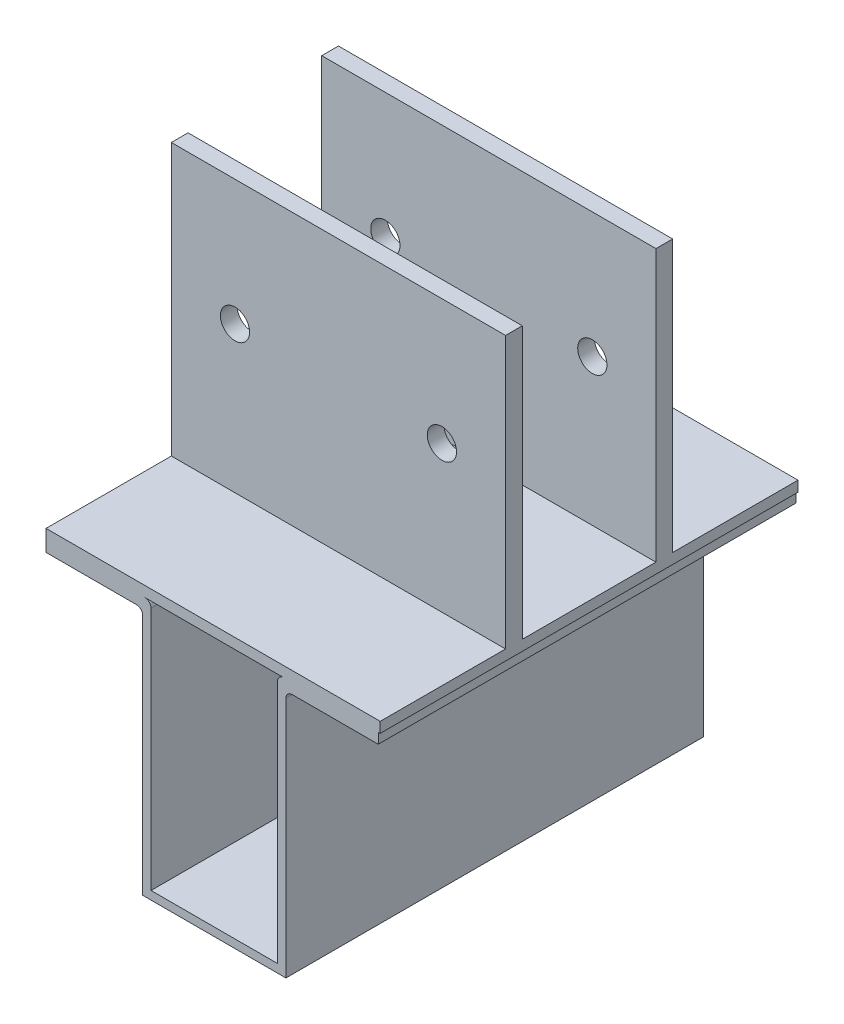
ISO-10303-21;
HEADER;
FILE_DESCRIPTION(('STEP AP214'),'2;1');
FILE_NAME('part.step','',(''),(''),'','','');
FILE_SCHEMA(('AUTOMOTIVE_DESIGN { 1 0 10303 214 1 1 1 1 }'));
ENDSEC;
DATA;
#1=APPLICATION_CONTEXT('core data for automotive mechanical design processes');
#2=APPLICATION_PROTOCOL_DEFINITION('international standard','automotive_design',2000,#1);
#3=PRODUCT_CONTEXT('',#1,'mechanical');
#4=PRODUCT('Part','Part','',(#3));
#5=PRODUCT_RELATED_PRODUCT_CATEGORY('part','',(#4));
#6=PRODUCT_DEFINITION_FORMATION('','',#4);
#7=PRODUCT_DEFINITION_CONTEXT('part definition',#1,'design');
#8=PRODUCT_DEFINITION('design','',#6,#7);
#9=PRODUCT_DEFINITION_SHAPE('','',#8);
#10=(LENGTH_UNIT() NAMED_UNIT(*) SI_UNIT(.MILLI.,.METRE.));
#11=(NAMED_UNIT(*) PLANE_ANGLE_UNIT() SI_UNIT($,.RADIAN.));
#12=(NAMED_UNIT(*) SI_UNIT($,.STERADIAN.) SOLID_ANGLE_UNIT());
#13=UNCERTAINTY_MEASURE_WITH_UNIT(LENGTH_MEASURE(1.E-05),#10,'distance_accuracy_value','');
#14=(GEOMETRIC_REPRESENTATION_CONTEXT(3) GLOBAL_UNCERTAINTY_ASSIGNED_CONTEXT((#13)) GLOBAL_UNIT_ASSIGNED_CONTEXT((#10,
#11,#12)) REPRESENTATION_CONTEXT('',''));
#15=CARTESIAN_POINT('',(0.,0.,0.));
#16=DIRECTION('',(0.,0.,1.));
#17=DIRECTION('',(1.,0.,0.));
#18=AXIS2_PLACEMENT_3D('',#15,#16,#17);
#19=CARTESIAN_POINT('',(0.,0.,0.));
#20=DIRECTION('',(0.,1.,0.));
#21=DIRECTION('',(0.,0.,1.));
#22=AXIS2_PLACEMENT_3D('',#19,#20,#21);
#23=PLANE('',#22);
#24=DIRECTION('',(1.,0.,0.));
#25=VECTOR('',#24,1.);
#26=CARTESIAN_POINT('',(40.,0.,100.));
#27=LINE('',#26,#25);
#28=CARTESIAN_POINT('',(119.056976735996,0.,100.));
#29=VERTEX_POINT('',#28);
#30=CARTESIAN_POINT('',(120.,0.,100.));
#31=VERTEX_POINT('',#30);
#32=EDGE_CURVE('E444',#29,#31,#27,.T.);
#33=ORIENTED_EDGE('',*,*,#32,.F.);
#34=DIRECTION('',(0.,0.,-1.));
#35=VECTOR('',#34,1.);
#36=CARTESIAN_POINT('',(119.056976735996,0.,100.));
#37=LINE('',#36,#35);
#38=CARTESIAN_POINT('',(119.056976735996,0.,-100.));
#39=VERTEX_POINT('',#38);
#40=EDGE_CURVE('E327',#29,#39,#37,.T.);
#41=ORIENTED_EDGE('',*,*,#40,.T.);
#42=DIRECTION('',(-1.,0.,0.));
#43=VECTOR('',#42,1.);
#44=CARTESIAN_POINT('',(40.,0.,-100.));
#45=LINE('',#44,#43);
#46=CARTESIAN_POINT('',(120.,0.,-100.));
#47=VERTEX_POINT('',#46);
#48=EDGE_CURVE('E447',#47,#39,#45,.T.);
#49=ORIENTED_EDGE('',*,*,#48,.F.);
#50=DIRECTION('',(0.,0.,1.));
#51=VECTOR('',#50,1.);
#52=CARTESIAN_POINT('',(120.,0.,100.));
#53=LINE('',#52,#51);
#54=EDGE_CURVE('E375',#47,#31,#53,.T.);
#55=ORIENTED_EDGE('',*,*,#54,.T.);
#56=EDGE_LOOP('',(#33,#41,#49,#55));
#57=FACE_BOUND('',#56,.T.);
#58=ADVANCED_FACE('F33',(#57),#23,.F.);
#59=CARTESIAN_POINT('',(0.,5.,0.));
#60=DIRECTION('',(0.,1.,0.));
#61=DIRECTION('',(0.,0.,1.));
#62=AXIS2_PLACEMENT_3D('',#59,#60,#61);
#63=PLANE('',#62);
#64=DIRECTION('',(-1.,0.,0.));
#65=VECTOR('',#64,1.);
#66=CARTESIAN_POINT('',(-40.,5.,32.));
#67=LINE('',#66,#65);
#68=CARTESIAN_POINT('',(120.,5.,32.));
#69=VERTEX_POINT('',#68);
#70=CARTESIAN_POINT('',(-40.,5.,32.));
#71=VERTEX_POINT('',#70);
#72=EDGE_CURVE('E403',#69,#71,#67,.T.);
#73=ORIENTED_EDGE('',*,*,#72,.F.);
#74=DIRECTION('',(0.,0.,1.));
#75=VECTOR('',#74,1.);
#76=CARTESIAN_POINT('',(120.,5.,100.));
#77=LINE('',#76,#75);
#78=CARTESIAN_POINT('',(120.,5.,-32.));
#79=VERTEX_POINT('',#78);
#80=EDGE_CURVE('E380',#79,#69,#77,.T.);
#81=ORIENTED_EDGE('',*,*,#80,.F.);
#82=DIRECTION('',(1.,0.,0.));
#83=VECTOR('',#82,1.);
#84=CARTESIAN_POINT('',(40.,5.,-32.));
#85=LINE('',#84,#83);
#86=CARTESIAN_POINT('',(-40.,5.,-32.));
#87=VERTEX_POINT('',#86);
#88=EDGE_CURVE('E419',#87,#79,#85,.T.);
#89=ORIENTED_EDGE('',*,*,#88,.F.);
#90=DIRECTION('',(0.,0.,1.));
#91=VECTOR('',#90,1.);
#92=CARTESIAN_POINT('',(-40.,5.,100.));
#93=LINE('',#92,#91);
#94=EDGE_CURVE('E436',#87,#71,#93,.T.);
#95=ORIENTED_EDGE('',*,*,#94,.T.);
#96=EDGE_LOOP('',(#73,#81,#89,#95));
#97=FACE_BOUND('',#96,.T.);
#98=ADVANCED_FACE('F474',(#97),#63,.T.);
#99=CARTESIAN_POINT('',(120.,5.,40.));
#100=VERTEX_POINT('',#99);
#101=CARTESIAN_POINT('',(120.,5.,100.));
#102=VERTEX_POINT('',#101);
#103=EDGE_CURVE('E381',#100,#102,#77,.T.);
#104=ORIENTED_EDGE('',*,*,#103,.F.);
#105=DIRECTION('',(1.,0.,0.));
#106=VECTOR('',#105,1.);
#107=CARTESIAN_POINT('',(-40.,5.,40.));
#108=LINE('',#107,#106);
#109=CARTESIAN_POINT('',(-40.,5.,40.));
#110=VERTEX_POINT('',#109);
#111=EDGE_CURVE('E58',#110,#100,#108,.T.);
#112=ORIENTED_EDGE('',*,*,#111,.F.);
#113=CARTESIAN_POINT('',(-40.,5.,100.));
#114=VERTEX_POINT('',#113);
#115=EDGE_CURVE('E437',#110,#114,#93,.T.);
#116=ORIENTED_EDGE('',*,*,#115,.T.);
#117=DIRECTION('',(1.,0.,0.));
#118=VECTOR('',#117,1.);
#119=CARTESIAN_POINT('',(40.,5.,100.));
#120=LINE('',#119,#118);
#121=EDGE_CURVE('E435',#114,#102,#120,.T.);
#122=ORIENTED_EDGE('',*,*,#121,.T.);
#123=EDGE_LOOP('',(#104,#112,#116,#122));
#124=FACE_BOUND('',#123,.T.);
#125=ADVANCED_FACE('F483',(#124),#63,.T.);
#126=CARTESIAN_POINT('',(-40.,5.,100.));
#127=DIRECTION('',(1.,0.,0.));
#128=DIRECTION('',(0.,0.,-1.));
#129=AXIS2_PLACEMENT_3D('',#126,#127,#128);
#130=PLANE('',#129);
#131=DIRECTION('',(0.,0.,1.));
#132=VECTOR('',#131,1.);
#133=CARTESIAN_POINT('',(-40.,0.,100.));
#134=LINE('',#133,#132);
#135=CARTESIAN_POINT('',(-40.,0.,-100.));
#136=VERTEX_POINT('',#135);
#137=CARTESIAN_POINT('',(-40.,0.,100.));
#138=VERTEX_POINT('',#137);
#139=EDGE_CURVE('E432',#136,#138,#134,.T.);
#140=ORIENTED_EDGE('',*,*,#139,.T.);
#141=DIRECTION('',(0.,-1.,0.));
#142=VECTOR('',#141,1.);
#143=CARTESIAN_POINT('',(-40.,5.,100.));
#144=LINE('',#143,#142);
#145=EDGE_CURVE('E11',#114,#138,#144,.T.);
#146=ORIENTED_EDGE('',*,*,#145,.F.);
#147=ORIENTED_EDGE('',*,*,#115,.F.);
#148=DIRECTION('',(0.,-1.,0.));
#149=VECTOR('',#148,1.);
#150=CARTESIAN_POINT('',(-40.,135.,40.));
#151=LINE('',#150,#149);
#152=CARTESIAN_POINT('',(-40.,135.,40.));
#153=VERTEX_POINT('',#152);
#154=EDGE_CURVE('E413',#153,#110,#151,.T.);
#155=ORIENTED_EDGE('',*,*,#154,.F.);
#156=DIRECTION('',(0.,0.,1.));
#157=VECTOR('',#156,1.);
#158=CARTESIAN_POINT('',(-40.,135.,32.));
#159=LINE('',#158,#157);
#160=CARTESIAN_POINT('',(-40.,135.,32.));
#161=VERTEX_POINT('',#160);
#162=EDGE_CURVE('E399',#161,#153,#159,.T.);
#163=ORIENTED_EDGE('',*,*,#162,.F.);
#164=DIRECTION('',(0.,-1.,0.));
#165=VECTOR('',#164,1.);
#166=CARTESIAN_POINT('',(-40.,135.,32.));
#167=LINE('',#166,#165);
#168=EDGE_CURVE('E407',#161,#71,#167,.T.);
#169=ORIENTED_EDGE('',*,*,#168,.T.);
#170=ORIENTED_EDGE('',*,*,#94,.F.);
#171=DIRECTION('',(0.,-1.,0.));
#172=VECTOR('',#171,1.);
#173=CARTESIAN_POINT('',(-40.,135.,-32.));
#174=LINE('',#173,#172);
#175=CARTESIAN_POINT('',(-40.,135.,-32.));
#176=VERTEX_POINT('',#175);
#177=EDGE_CURVE('E423',#176,#87,#174,.T.);
#178=ORIENTED_EDGE('',*,*,#177,.F.);
#179=DIRECTION('',(0.,0.,1.));
#180=VECTOR('',#179,1.);
#181=CARTESIAN_POINT('',(-40.,135.,-32.));
#182=LINE('',#181,#180);
#183=CARTESIAN_POINT('',(-40.,135.,-40.));
#184=VERTEX_POINT('',#183);
#185=EDGE_CURVE('E418',#184,#176,#182,.T.);
#186=ORIENTED_EDGE('',*,*,#185,.F.);
#187=DIRECTION('',(0.,-1.,0.));
#188=VECTOR('',#187,1.);
#189=CARTESIAN_POINT('',(-40.,135.,-40.));
#190=LINE('',#189,#188);
#191=CARTESIAN_POINT('',(-40.,5.,-40.));
#192=VERTEX_POINT('',#191);
#193=EDGE_CURVE('E429',#184,#192,#190,.T.);
#194=ORIENTED_EDGE('',*,*,#193,.T.);
#195=CARTESIAN_POINT('',(-40.,5.,-100.));
#196=VERTEX_POINT('',#195);
#197=EDGE_CURVE('E433',#196,#192,#93,.T.);
#198=ORIENTED_EDGE('',*,*,#197,.F.);
#199=DIRECTION('',(0.,-1.,0.));
#200=VECTOR('',#199,1.);
#201=CARTESIAN_POINT('',(-40.,5.,-100.));
#202=LINE('',#201,#200);
#203=EDGE_CURVE('E42',#196,#136,#202,.T.);
#204=ORIENTED_EDGE('',*,*,#203,.T.);
#205=EDGE_LOOP('',(#140,#146,#147,#155,#163,#169,#170,#178,#186,#194,#198,#204));
#206=FACE_BOUND('',#205,.T.);
#207=ADVANCED_FACE('F35',(#206),#130,.F.);
#208=CARTESIAN_POINT('',(40.,5.,100.));
#209=DIRECTION('',(0.,0.,-1.));
#210=DIRECTION('',(-1.,0.,0.));
#211=AXIS2_PLACEMENT_3D('',#208,#209,#210);
#212=PLANE('',#211);
#213=CARTESIAN_POINT('',(7.27123143464801,0.,100.));
#214=VERTEX_POINT('',#213);
#215=CARTESIAN_POINT('',(73.8451123410804,0.,100.));
#216=VERTEX_POINT('',#215);
#217=EDGE_CURVE('E446',#214,#216,#27,.T.);
#218=ORIENTED_EDGE('',*,*,#217,.T.);
#219=CARTESIAN_POINT('',(73.8451123410804,-3.,100.));
#220=DIRECTION('',(0.,0.,-1.));
#221=DIRECTION('',(-1.,0.,0.));
#222=AXIS2_PLACEMENT_3D('',#219,#220,#221);
#223=CIRCLE('',#222,3.);
#224=CARTESIAN_POINT('',(70.8451123410804,-3.00000000000002,100.));
#225=VERTEX_POINT('',#224);
#226=EDGE_CURVE('E266',#216,#225,#223,.F.);
#227=ORIENTED_EDGE('',*,*,#226,.T.);
#228=DIRECTION('',(0.,-1.,0.));
#229=VECTOR('',#228,1.);
#230=CARTESIAN_POINT('',(70.8451123410804,0.,100.));
#231=LINE('',#230,#229);
#232=CARTESIAN_POINT('',(70.8451123410803,-120.,100.));
#233=VERTEX_POINT('',#232);
#234=EDGE_CURVE('E264',#225,#233,#231,.T.);
#235=ORIENTED_EDGE('',*,*,#234,.T.);
#236=DIRECTION('',(1.,0.,0.));
#237=VECTOR('',#236,1.);
#238=CARTESIAN_POINT('',(0.,-120.,100.));
#239=LINE('',#238,#237);
#240=CARTESIAN_POINT('',(10.271231434648,-120.,100.));
#241=VERTEX_POINT('',#240);
#242=EDGE_CURVE('E261',#241,#233,#239,.T.);
#243=ORIENTED_EDGE('',*,*,#242,.F.);
#244=DIRECTION('',(0.,-1.,0.));
#245=VECTOR('',#244,1.);
#246=CARTESIAN_POINT('',(10.271231434648,0.,100.));
#247=LINE('',#246,#245);
#248=CARTESIAN_POINT('',(10.271231434648,-3.00000000000002,100.));
#249=VERTEX_POINT('',#248);
#250=EDGE_CURVE('E258',#249,#241,#247,.T.);
#251=ORIENTED_EDGE('',*,*,#250,.F.);
#252=CARTESIAN_POINT('',(7.27123143464803,-3.,100.));
#253=DIRECTION('',(0.,0.,-1.));
#254=DIRECTION('',(-1.,0.,0.));
#255=AXIS2_PLACEMENT_3D('',#252,#253,#254);
#256=CIRCLE('',#255,3.);
#257=EDGE_CURVE('E255',#214,#249,#256,.T.);
#258=ORIENTED_EDGE('',*,*,#257,.F.);
#259=EDGE_LOOP('',(#218,#227,#235,#243,#251,#258));
#260=FACE_BOUND('',#259,.T.);
#261=ORIENTED_EDGE('',*,*,#145,.T.);
#262=DIRECTION('',(-1.,0.,0.));
#263=VECTOR('',#262,1.);
#264=CARTESIAN_POINT('',(0.,0.,100.));
#265=LINE('',#264,#263);
#266=CARTESIAN_POINT('',(-40.0009690455203,0.,100.));
#267=VERTEX_POINT('',#266);
#268=EDGE_CURVE('E253',#138,#267,#265,.T.);
#269=ORIENTED_EDGE('',*,*,#268,.T.);
#270=DIRECTION('',(0.,-1.,0.));
#271=VECTOR('',#270,1.);
#272=CARTESIAN_POINT('',(-40.0009690455203,0.,100.));
#273=LINE('',#272,#271);
#274=CARTESIAN_POINT('',(-40.0009690455203,-4.97783194585386,100.));
#275=VERTEX_POINT('',#274);
#276=EDGE_CURVE('E249',#267,#275,#273,.T.);
#277=ORIENTED_EDGE('',*,*,#276,.T.);
#278=DIRECTION('',(-1.,0.,0.));
#279=VECTOR('',#278,1.);
#280=CARTESIAN_POINT('',(0.,-4.97783194585386,100.));
#281=LINE('',#280,#279);
#282=CARTESIAN_POINT('',(3.27123143464801,-4.97783194585386,100.));
#283=VERTEX_POINT('',#282);
#284=EDGE_CURVE('E247',#283,#275,#281,.T.);
#285=ORIENTED_EDGE('',*,*,#284,.F.);
#286=CARTESIAN_POINT('',(3.27123143464803,-7.97783194585385,100.));
#287=DIRECTION('',(0.,0.,-1.));
#288=DIRECTION('',(-1.,0.,0.));
#289=AXIS2_PLACEMENT_3D('',#286,#287,#288);
#290=CIRCLE('',#289,3.);
#291=CARTESIAN_POINT('',(6.27123143464803,-7.97783194585388,100.));
#292=VERTEX_POINT('',#291);
#293=EDGE_CURVE('E226',#292,#283,#290,.F.);
#294=ORIENTED_EDGE('',*,*,#293,.F.);
#295=DIRECTION('',(0.,-1.,0.));
#296=VECTOR('',#295,1.);
#297=CARTESIAN_POINT('',(6.27123143464803,0.,100.));
#298=LINE('',#297,#296);
#299=CARTESIAN_POINT('',(6.27123143464803,-124.,100.));
#300=VERTEX_POINT('',#299);
#301=EDGE_CURVE('E237',#292,#300,#298,.T.);
#302=ORIENTED_EDGE('',*,*,#301,.T.);
#303=DIRECTION('',(1.,0.,0.));
#304=VECTOR('',#303,1.);
#305=CARTESIAN_POINT('',(0.,-124.,100.));
#306=LINE('',#305,#304);
#307=CARTESIAN_POINT('',(74.8451123410804,-124.,100.));
#308=VERTEX_POINT('',#307);
#309=EDGE_CURVE('E233',#300,#308,#306,.T.);
#310=ORIENTED_EDGE('',*,*,#309,.T.);
#311=DIRECTION('',(0.,-1.,0.));
#312=VECTOR('',#311,1.);
#313=CARTESIAN_POINT('',(74.8451123410804,0.,100.));
#314=LINE('',#313,#312);
#315=CARTESIAN_POINT('',(74.8451123410804,-7.97783194585388,100.));
#316=VERTEX_POINT('',#315);
#317=EDGE_CURVE('E275',#316,#308,#314,.T.);
#318=ORIENTED_EDGE('',*,*,#317,.F.);
#319=CARTESIAN_POINT('',(77.8451123410804,-7.97783194585385,100.));
#320=DIRECTION('',(0.,0.,-1.));
#321=DIRECTION('',(-1.,0.,0.));
#322=AXIS2_PLACEMENT_3D('',#319,#320,#321);
#323=CIRCLE('',#322,3.);
#324=CARTESIAN_POINT('',(77.8451123410804,-4.97783194585386,100.));
#325=VERTEX_POINT('',#324);
#326=EDGE_CURVE('E273',#316,#325,#323,.T.);
#327=ORIENTED_EDGE('',*,*,#326,.T.);
#328=DIRECTION('',(1.,0.,0.));
#329=VECTOR('',#328,1.);
#330=CARTESIAN_POINT('',(0.,-4.97783194585386,100.));
#331=LINE('',#330,#329);
#332=CARTESIAN_POINT('',(119.056976735996,-4.97783194585386,100.));
#333=VERTEX_POINT('',#332);
#334=EDGE_CURVE('E271',#325,#333,#331,.T.);
#335=ORIENTED_EDGE('',*,*,#334,.T.);
#336=DIRECTION('',(0.,-1.,0.));
#337=VECTOR('',#336,1.);
#338=CARTESIAN_POINT('',(119.056976735996,0.,100.));
#339=LINE('',#338,#337);
#340=EDGE_CURVE('E268',#29,#333,#339,.T.);
#341=ORIENTED_EDGE('',*,*,#340,.F.);
#342=ORIENTED_EDGE('',*,*,#32,.T.);
#343=DIRECTION('',(0.,-1.,0.));
#344=VECTOR('',#343,1.);
#345=CARTESIAN_POINT('',(120.,5.,100.));
#346=LINE('',#345,#344);
#347=EDGE_CURVE('E379',#102,#31,#346,.T.);
#348=ORIENTED_EDGE('',*,*,#347,.F.);
#349=ORIENTED_EDGE('',*,*,#121,.F.);
#350=EDGE_LOOP('',(#261,#269,#277,#285,#294,#302,#310,#318,#327,#335,#341,#342,#348,#349));
#351=FACE_BOUND('',#350,.T.);
#352=ADVANCED_FACE('F245',(#260,#351),#212,.F.);
#353=CARTESIAN_POINT('',(40.,5.,-100.));
#354=DIRECTION('',(0.,0.,1.));
#355=DIRECTION('',(1.,0.,0.));
#356=AXIS2_PLACEMENT_3D('',#353,#354,#355);
#357=PLANE('',#356);
#358=CARTESIAN_POINT('',(73.8451123410804,-3.,-100.));
#359=DIRECTION('',(0.,0.,-1.));
#360=DIRECTION('',(-1.,0.,0.));
#361=AXIS2_PLACEMENT_3D('',#358,#359,#360);
#362=CIRCLE('',#361,3.);
#363=CARTESIAN_POINT('',(73.8451123410804,0.,-100.));
#364=VERTEX_POINT('',#363);
#365=CARTESIAN_POINT('',(70.8451123410804,-3.00000000000002,-100.));
#366=VERTEX_POINT('',#365);
#367=EDGE_CURVE('E50',#364,#366,#362,.F.);
#368=ORIENTED_EDGE('',*,*,#367,.F.);
#369=CARTESIAN_POINT('',(7.27123143464801,0.,-100.));
#370=VERTEX_POINT('',#369);
#371=EDGE_CURVE('E450',#364,#370,#45,.T.);
#372=ORIENTED_EDGE('',*,*,#371,.T.);
#373=CARTESIAN_POINT('',(7.27123143464803,-3.,-100.));
#374=DIRECTION('',(0.,0.,-1.));
#375=DIRECTION('',(-1.,0.,0.));
#376=AXIS2_PLACEMENT_3D('',#373,#374,#375);
#377=CIRCLE('',#376,3.);
#378=CARTESIAN_POINT('',(10.271231434648,-3.00000000000002,-100.));
#379=VERTEX_POINT('',#378);
#380=EDGE_CURVE('E290',#370,#379,#377,.T.);
#381=ORIENTED_EDGE('',*,*,#380,.T.);
#382=DIRECTION('',(0.,-1.,0.));
#383=VECTOR('',#382,1.);
#384=CARTESIAN_POINT('',(10.271231434648,0.,-100.));
#385=LINE('',#384,#383);
#386=CARTESIAN_POINT('',(10.271231434648,-120.,-100.));
#387=VERTEX_POINT('',#386);
#388=EDGE_CURVE('E293',#379,#387,#385,.T.);
#389=ORIENTED_EDGE('',*,*,#388,.T.);
#390=DIRECTION('',(1.,0.,0.));
#391=VECTOR('',#390,1.);
#392=CARTESIAN_POINT('',(0.,-120.,-100.));
#393=LINE('',#392,#391);
#394=CARTESIAN_POINT('',(70.8451123410803,-120.,-100.));
#395=VERTEX_POINT('',#394);
#396=EDGE_CURVE('E296',#387,#395,#393,.T.);
#397=ORIENTED_EDGE('',*,*,#396,.T.);
#398=DIRECTION('',(0.,-1.,0.));
#399=VECTOR('',#398,1.);
#400=CARTESIAN_POINT('',(70.8451123410804,0.,-100.));
#401=LINE('',#400,#399);
#402=EDGE_CURVE('E299',#366,#395,#401,.T.);
#403=ORIENTED_EDGE('',*,*,#402,.F.);
#404=EDGE_LOOP('',(#368,#372,#381,#389,#397,#403));
#405=FACE_BOUND('',#404,.T.);
#406=ORIENTED_EDGE('',*,*,#48,.T.);
#407=DIRECTION('',(0.,-1.,0.));
#408=VECTOR('',#407,1.);
#409=CARTESIAN_POINT('',(119.056976735996,0.,-100.));
#410=LINE('',#409,#408);
#411=CARTESIAN_POINT('',(119.056976735996,-4.97783194585386,-100.));
#412=VERTEX_POINT('',#411);
#413=EDGE_CURVE('E303',#39,#412,#410,.T.);
#414=ORIENTED_EDGE('',*,*,#413,.T.);
#415=DIRECTION('',(1.,0.,0.));
#416=VECTOR('',#415,1.);
#417=CARTESIAN_POINT('',(0.,-4.97783194585386,-100.));
#418=LINE('',#417,#416);
#419=CARTESIAN_POINT('',(77.8451123410804,-4.97783194585386,-100.));
#420=VERTEX_POINT('',#419);
#421=EDGE_CURVE('E306',#420,#412,#418,.T.);
#422=ORIENTED_EDGE('',*,*,#421,.F.);
#423=CARTESIAN_POINT('',(77.8451123410804,-7.97783194585385,-100.));
#424=DIRECTION('',(0.,0.,-1.));
#425=DIRECTION('',(-1.,0.,0.));
#426=AXIS2_PLACEMENT_3D('',#423,#424,#425);
#427=CIRCLE('',#426,3.);
#428=CARTESIAN_POINT('',(74.8451123410804,-7.97783194585388,-100.));
#429=VERTEX_POINT('',#428);
#430=EDGE_CURVE('E309',#429,#420,#427,.T.);
#431=ORIENTED_EDGE('',*,*,#430,.F.);
#432=DIRECTION('',(0.,-1.,0.));
#433=VECTOR('',#432,1.);
#434=CARTESIAN_POINT('',(74.8451123410804,0.,-100.));
#435=LINE('',#434,#433);
#436=CARTESIAN_POINT('',(74.8451123410804,-124.,-100.));
#437=VERTEX_POINT('',#436);
#438=EDGE_CURVE('E311',#429,#437,#435,.T.);
#439=ORIENTED_EDGE('',*,*,#438,.T.);
#440=DIRECTION('',(1.,0.,0.));
#441=VECTOR('',#440,1.);
#442=CARTESIAN_POINT('',(0.,-124.,-100.));
#443=LINE('',#442,#441);
#444=CARTESIAN_POINT('',(6.27123143464803,-124.,-100.));
#445=VERTEX_POINT('',#444);
#446=EDGE_CURVE('E242',#445,#437,#443,.T.);
#447=ORIENTED_EDGE('',*,*,#446,.F.);
#448=DIRECTION('',(0.,-1.,0.));
#449=VECTOR('',#448,1.);
#450=CARTESIAN_POINT('',(6.27123143464803,0.,-100.));
#451=LINE('',#450,#449);
#452=CARTESIAN_POINT('',(6.27123143464803,-7.97783194585388,-100.));
#453=VERTEX_POINT('',#452);
#454=EDGE_CURVE('E279',#453,#445,#451,.T.);
#455=ORIENTED_EDGE('',*,*,#454,.F.);
#456=CARTESIAN_POINT('',(3.27123143464803,-7.97783194585385,-100.));
#457=DIRECTION('',(0.,0.,-1.));
#458=DIRECTION('',(-1.,0.,0.));
#459=AXIS2_PLACEMENT_3D('',#456,#457,#458);
#460=CIRCLE('',#459,3.);
#461=CARTESIAN_POINT('',(3.27123143464801,-4.97783194585386,-100.));
#462=VERTEX_POINT('',#461);
#463=EDGE_CURVE('E228',#453,#462,#460,.F.);
#464=ORIENTED_EDGE('',*,*,#463,.T.);
#465=DIRECTION('',(-1.,0.,0.));
#466=VECTOR('',#465,1.);
#467=CARTESIAN_POINT('',(0.,-4.97783194585386,-100.));
#468=LINE('',#467,#466);
#469=CARTESIAN_POINT('',(-40.0009690455203,-4.97783194585386,-100.));
#470=VERTEX_POINT('',#469);
#471=EDGE_CURVE('E282',#462,#470,#468,.T.);
#472=ORIENTED_EDGE('',*,*,#471,.T.);
#473=DIRECTION('',(0.,-1.,0.));
#474=VECTOR('',#473,1.);
#475=CARTESIAN_POINT('',(-40.0009690455203,0.,-100.));
#476=LINE('',#475,#474);
#477=CARTESIAN_POINT('',(-40.0009690455203,0.,-100.));
#478=VERTEX_POINT('',#477);
#479=EDGE_CURVE('E285',#478,#470,#476,.T.);
#480=ORIENTED_EDGE('',*,*,#479,.F.);
#481=DIRECTION('',(-1.,0.,0.));
#482=VECTOR('',#481,1.);
#483=CARTESIAN_POINT('',(0.,0.,-100.));
#484=LINE('',#483,#482);
#485=EDGE_CURVE('E288',#136,#478,#484,.T.);
#486=ORIENTED_EDGE('',*,*,#485,.F.);
#487=ORIENTED_EDGE('',*,*,#203,.F.);
#488=DIRECTION('',(-1.,0.,0.));
#489=VECTOR('',#488,1.);
#490=CARTESIAN_POINT('',(40.,5.,-100.));
#491=LINE('',#490,#489);
#492=CARTESIAN_POINT('',(120.,5.,-100.));
#493=VERTEX_POINT('',#492);
#494=EDGE_CURVE('E440',#493,#196,#491,.T.);
#495=ORIENTED_EDGE('',*,*,#494,.F.);
#496=DIRECTION('',(0.,-1.,0.));
#497=VECTOR('',#496,1.);
#498=CARTESIAN_POINT('',(120.,5.,-100.));
#499=LINE('',#498,#497);
#500=EDGE_CURVE('E386',#493,#47,#499,.T.);
#501=ORIENTED_EDGE('',*,*,#500,.T.);
#502=EDGE_LOOP('',(#406,#414,#422,#431,#439,#447,#455,#464,#472,#480,#486,#487,#495,#501));
#503=FACE_BOUND('',#502,.T.);
#504=ADVANCED_FACE('F501',(#405,#503),#357,.F.);
#505=DIRECTION('',(-1.,0.,0.));
#506=VECTOR('',#505,1.);
#507=CARTESIAN_POINT('',(40.,5.,-40.));
#508=LINE('',#507,#506);
#509=CARTESIAN_POINT('',(120.,5.,-40.));
#510=VERTEX_POINT('',#509);
#511=EDGE_CURVE('E415',#510,#192,#508,.T.);
#512=ORIENTED_EDGE('',*,*,#511,.F.);
#513=EDGE_CURVE('E376',#493,#510,#77,.T.);
#514=ORIENTED_EDGE('',*,*,#513,.F.);
#515=ORIENTED_EDGE('',*,*,#494,.T.);
#516=ORIENTED_EDGE('',*,*,#197,.T.);
#517=EDGE_LOOP('',(#512,#514,#515,#516));
#518=FACE_BOUND('',#517,.T.);
#519=ADVANCED_FACE('F486',(#518),#63,.T.);
#520=ORIENTED_EDGE('',*,*,#371,.F.);
#521=DIRECTION('',(0.,0.,-1.));
#522=VECTOR('',#521,1.);
#523=CARTESIAN_POINT('',(73.8451123410804,0.,100.));
#524=LINE('',#523,#522);
#525=EDGE_CURVE('E330',#216,#364,#524,.T.);
#526=ORIENTED_EDGE('',*,*,#525,.F.);
#527=ORIENTED_EDGE('',*,*,#217,.F.);
#528=DIRECTION('',(0.,0.,-1.));
#529=VECTOR('',#528,1.);
#530=CARTESIAN_POINT('',(7.27123143464801,0.,100.));
#531=LINE('',#530,#529);
#532=EDGE_CURVE('E341',#214,#370,#531,.T.);
#533=ORIENTED_EDGE('',*,*,#532,.T.);
#534=EDGE_LOOP('',(#520,#526,#527,#533));
#535=FACE_BOUND('',#534,.T.);
#536=ADVANCED_FACE('F477',(#535),#23,.F.);
#537=CARTESIAN_POINT('',(40.,135.,-40.));
#538=DIRECTION('',(0.,0.,1.));
#539=DIRECTION('',(1.,0.,0.));
#540=AXIS2_PLACEMENT_3D('',#537,#538,#539);
#541=PLANE('',#540);
#542=CARTESIAN_POINT('',(89.5391993178806,75.,-40.));
#543=DIRECTION('',(0.,0.,1.));
#544=DIRECTION('',(1.,0.,0.));
#545=AXIS2_PLACEMENT_3D('',#542,#543,#544);
#546=CIRCLE('',#545,7.);
#547=CARTESIAN_POINT('',(96.5391993178806,75.,-40.));
#548=VERTEX_POINT('',#547);
#549=EDGE_CURVE('E355',#548,#548,#546,.F.);
#550=ORIENTED_EDGE('',*,*,#549,.F.);
#551=EDGE_LOOP('',(#550));
#552=FACE_BOUND('',#551,.T.);
#553=CARTESIAN_POINT('',(-9.53919931788061,75.,-40.));
#554=DIRECTION('',(0.,0.,1.));
#555=DIRECTION('',(1.,0.,0.));
#556=AXIS2_PLACEMENT_3D('',#553,#554,#555);
#557=CIRCLE('',#556,7.);
#558=CARTESIAN_POINT('',(-2.53919931788061,75.,-40.));
#559=VERTEX_POINT('',#558);
#560=EDGE_CURVE('E396',#559,#559,#557,.T.);
#561=ORIENTED_EDGE('',*,*,#560,.T.);
#562=EDGE_LOOP('',(#561));
#563=FACE_BOUND('',#562,.T.);
#564=ORIENTED_EDGE('',*,*,#511,.T.);
#565=ORIENTED_EDGE('',*,*,#193,.F.);
#566=DIRECTION('',(-1.,0.,0.));
#567=VECTOR('',#566,1.);
#568=CARTESIAN_POINT('',(40.,135.,-40.));
#569=LINE('',#568,#567);
#570=CARTESIAN_POINT('',(120.,135.,-40.));
#571=VERTEX_POINT('',#570);
#572=EDGE_CURVE('E416',#571,#184,#569,.T.);
#573=ORIENTED_EDGE('',*,*,#572,.F.);
#574=DIRECTION('',(0.,-1.,0.));
#575=VECTOR('',#574,1.);
#576=CARTESIAN_POINT('',(120.,135.,-40.));
#577=LINE('',#576,#575);
#578=EDGE_CURVE('E369',#571,#510,#577,.T.);
#579=ORIENTED_EDGE('',*,*,#578,.T.);
#580=EDGE_LOOP('',(#564,#565,#573,#579));
#581=FACE_BOUND('',#580,.T.);
#582=ADVANCED_FACE('F490',(#552,#563,#581),#541,.F.);
#583=CARTESIAN_POINT('',(40.,135.,-32.));
#584=DIRECTION('',(0.,0.,-1.));
#585=DIRECTION('',(-1.,0.,0.));
#586=AXIS2_PLACEMENT_3D('',#583,#584,#585);
#587=PLANE('',#586);
#588=CARTESIAN_POINT('',(89.5391993178806,75.,-32.));
#589=DIRECTION('',(0.,0.,-1.));
#590=DIRECTION('',(-1.,0.,0.));
#591=AXIS2_PLACEMENT_3D('',#588,#589,#590);
#592=CIRCLE('',#591,7.);
#593=CARTESIAN_POINT('',(82.5391993178806,75.,-32.));
#594=VERTEX_POINT('',#593);
#595=EDGE_CURVE('E352',#594,#594,#592,.F.);
#596=ORIENTED_EDGE('',*,*,#595,.F.);
#597=EDGE_LOOP('',(#596));
#598=FACE_BOUND('',#597,.T.);
#599=CARTESIAN_POINT('',(-9.53919931788061,75.,-32.));
#600=DIRECTION('',(0.,0.,-1.));
#601=DIRECTION('',(-1.,0.,0.));
#602=AXIS2_PLACEMENT_3D('',#599,#600,#601);
#603=CIRCLE('',#602,7.);
#604=CARTESIAN_POINT('',(-16.5391993178806,75.,-32.));
#605=VERTEX_POINT('',#604);
#606=EDGE_CURVE('E393',#605,#605,#603,.T.);
#607=ORIENTED_EDGE('',*,*,#606,.T.);
#608=EDGE_LOOP('',(#607));
#609=FACE_BOUND('',#608,.T.);
#610=ORIENTED_EDGE('',*,*,#88,.T.);
#611=DIRECTION('',(0.,-1.,0.));
#612=VECTOR('',#611,1.);
#613=CARTESIAN_POINT('',(120.,135.,-32.));
#614=LINE('',#613,#612);
#615=CARTESIAN_POINT('',(120.,135.,-32.));
#616=VERTEX_POINT('',#615);
#617=EDGE_CURVE('E372',#616,#79,#614,.T.);
#618=ORIENTED_EDGE('',*,*,#617,.F.);
#619=DIRECTION('',(1.,0.,0.));
#620=VECTOR('',#619,1.);
#621=CARTESIAN_POINT('',(40.,135.,-32.));
#622=LINE('',#621,#620);
#623=EDGE_CURVE('E421',#176,#616,#622,.T.);
#624=ORIENTED_EDGE('',*,*,#623,.F.);
#625=ORIENTED_EDGE('',*,*,#177,.T.);
#626=EDGE_LOOP('',(#610,#618,#624,#625));
#627=FACE_BOUND('',#626,.T.);
#628=ADVANCED_FACE('F497',(#598,#609,#627),#587,.F.);
#629=CARTESIAN_POINT('',(0.,135.,0.));
#630=DIRECTION('',(0.,1.,0.));
#631=DIRECTION('',(0.,0.,1.));
#632=AXIS2_PLACEMENT_3D('',#629,#630,#631);
#633=PLANE('',#632);
#634=ORIENTED_EDGE('',*,*,#623,.T.);
#635=DIRECTION('',(0.,0.,1.));
#636=VECTOR('',#635,1.);
#637=CARTESIAN_POINT('',(120.,135.,-32.));
#638=LINE('',#637,#636);
#639=EDGE_CURVE('E366',#571,#616,#638,.T.);
#640=ORIENTED_EDGE('',*,*,#639,.F.);
#641=ORIENTED_EDGE('',*,*,#572,.T.);
#642=ORIENTED_EDGE('',*,*,#185,.T.);
#643=EDGE_LOOP('',(#634,#640,#641,#642));
#644=FACE_BOUND('',#643,.T.);
#645=ADVANCED_FACE('F583',(#644),#633,.T.);
#646=CARTESIAN_POINT('',(-40.,135.,40.));
#647=DIRECTION('',(0.,0.,-1.));
#648=DIRECTION('',(-1.,0.,0.));
#649=AXIS2_PLACEMENT_3D('',#646,#647,#648);
#650=PLANE('',#649);
#651=CARTESIAN_POINT('',(89.5391993178806,75.,40.));
#652=DIRECTION('',(0.,0.,-1.));
#653=DIRECTION('',(-1.,0.,0.));
#654=AXIS2_PLACEMENT_3D('',#651,#652,#653);
#655=CIRCLE('',#654,7.);
#656=CARTESIAN_POINT('',(82.5391993178806,75.,40.));
#657=VERTEX_POINT('',#656);
#658=EDGE_CURVE('E317',#657,#657,#655,.T.);
#659=ORIENTED_EDGE('',*,*,#658,.T.);
#660=EDGE_LOOP('',(#659));
#661=FACE_BOUND('',#660,.T.);
#662=CARTESIAN_POINT('',(-9.53919931788061,75.,40.));
#663=DIRECTION('',(0.,0.,1.));
#664=DIRECTION('',(1.,0.,0.));
#665=AXIS2_PLACEMENT_3D('',#662,#663,#664);
#666=CIRCLE('',#665,7.);
#667=CARTESIAN_POINT('',(-2.53919931788061,75.,40.));
#668=VERTEX_POINT('',#667);
#669=EDGE_CURVE('E389',#668,#668,#666,.T.);
#670=ORIENTED_EDGE('',*,*,#669,.F.);
#671=EDGE_LOOP('',(#670));
#672=FACE_BOUND('',#671,.T.);
#673=ORIENTED_EDGE('',*,*,#111,.T.);
#674=DIRECTION('',(0.,-1.,0.));
#675=VECTOR('',#674,1.);
#676=CARTESIAN_POINT('',(120.,135.,40.));
#677=LINE('',#676,#675);
#678=CARTESIAN_POINT('',(120.,135.,40.));
#679=VERTEX_POINT('',#678);
#680=EDGE_CURVE('E361',#679,#100,#677,.T.);
#681=ORIENTED_EDGE('',*,*,#680,.F.);
#682=DIRECTION('',(1.,0.,0.));
#683=VECTOR('',#682,1.);
#684=CARTESIAN_POINT('',(-40.,135.,40.));
#685=LINE('',#684,#683);
#686=EDGE_CURVE('E402',#153,#679,#685,.T.);
#687=ORIENTED_EDGE('',*,*,#686,.F.);
#688=ORIENTED_EDGE('',*,*,#154,.T.);
#689=EDGE_LOOP('',(#673,#681,#687,#688));
#690=FACE_BOUND('',#689,.T.);
#691=ADVANCED_FACE('F757',(#661,#672,#690),#650,.F.);
#692=CARTESIAN_POINT('',(-40.,135.,32.));
#693=DIRECTION('',(0.,0.,1.));
#694=DIRECTION('',(1.,0.,0.));
#695=AXIS2_PLACEMENT_3D('',#692,#693,#694);
#696=PLANE('',#695);
#697=CARTESIAN_POINT('',(89.5391993178806,75.,32.));
#698=DIRECTION('',(0.,0.,1.));
#699=DIRECTION('',(1.,0.,0.));
#700=AXIS2_PLACEMENT_3D('',#697,#698,#699);
#701=CIRCLE('',#700,7.);
#702=CARTESIAN_POINT('',(96.5391993178806,75.,32.));
#703=VERTEX_POINT('',#702);
#704=EDGE_CURVE('E37',#703,#703,#701,.F.);
#705=ORIENTED_EDGE('',*,*,#704,.F.);
#706=EDGE_LOOP('',(#705));
#707=FACE_BOUND('',#706,.T.);
#708=CARTESIAN_POINT('',(-9.53919931788061,75.,32.));
#709=DIRECTION('',(0.,0.,1.));
#710=DIRECTION('',(1.,0.,0.));
#711=AXIS2_PLACEMENT_3D('',#708,#709,#710);
#712=CIRCLE('',#711,7.);
#713=CARTESIAN_POINT('',(-2.53919931788061,75.,32.));
#714=VERTEX_POINT('',#713);
#715=EDGE_CURVE('E392',#714,#714,#712,.T.);
#716=ORIENTED_EDGE('',*,*,#715,.T.);
#717=EDGE_LOOP('',(#716));
#718=FACE_BOUND('',#717,.T.);
#719=ORIENTED_EDGE('',*,*,#72,.T.);
#720=ORIENTED_EDGE('',*,*,#168,.F.);
#721=DIRECTION('',(-1.,0.,0.));
#722=VECTOR('',#721,1.);
#723=CARTESIAN_POINT('',(-40.,135.,32.));
#724=LINE('',#723,#722);
#725=CARTESIAN_POINT('',(120.,135.,32.));
#726=VERTEX_POINT('',#725);
#727=EDGE_CURVE('E405',#726,#161,#724,.T.);
#728=ORIENTED_EDGE('',*,*,#727,.F.);
#729=DIRECTION('',(0.,-1.,0.));
#730=VECTOR('',#729,1.);
#731=CARTESIAN_POINT('',(120.,135.,32.));
#732=LINE('',#731,#730);
#733=EDGE_CURVE('E363',#726,#69,#732,.T.);
#734=ORIENTED_EDGE('',*,*,#733,.T.);
#735=EDGE_LOOP('',(#719,#720,#728,#734));
#736=FACE_BOUND('',#735,.T.);
#737=ADVANCED_FACE('F455',(#707,#718,#736),#696,.F.);
#738=CARTESIAN_POINT('',(0.,135.,0.));
#739=DIRECTION('',(0.,1.,0.));
#740=DIRECTION('',(0.,0.,1.));
#741=AXIS2_PLACEMENT_3D('',#738,#739,#740);
#742=PLANE('',#741);
#743=ORIENTED_EDGE('',*,*,#162,.T.);
#744=ORIENTED_EDGE('',*,*,#686,.T.);
#745=DIRECTION('',(0.,0.,1.));
#746=VECTOR('',#745,1.);
#747=CARTESIAN_POINT('',(120.,135.,32.));
#748=LINE('',#747,#746);
#749=EDGE_CURVE('E358',#726,#679,#748,.T.);
#750=ORIENTED_EDGE('',*,*,#749,.F.);
#751=ORIENTED_EDGE('',*,*,#727,.T.);
#752=EDGE_LOOP('',(#743,#744,#750,#751));
#753=FACE_BOUND('',#752,.T.);
#754=ADVANCED_FACE('F461',(#753),#742,.T.);
#755=CARTESIAN_POINT('',(-9.53919931788061,75.,-100.));
#756=DIRECTION('',(0.,0.,1.));
#757=DIRECTION('',(1.,0.,0.));
#758=AXIS2_PLACEMENT_3D('',#755,#756,#757);
#759=CYLINDRICAL_SURFACE('',#758,7.);
#760=ORIENTED_EDGE('',*,*,#669,.T.);
#761=EDGE_LOOP('',(#760));
#762=FACE_BOUND('',#761,.T.);
#763=ORIENTED_EDGE('',*,*,#715,.F.);
#764=EDGE_LOOP('',(#763));
#765=FACE_BOUND('',#764,.T.);
#766=ADVANCED_FACE('F458',(#762,#765),#759,.F.);
#767=ORIENTED_EDGE('',*,*,#606,.F.);
#768=EDGE_LOOP('',(#767));
#769=FACE_BOUND('',#768,.T.);
#770=ORIENTED_EDGE('',*,*,#560,.F.);
#771=EDGE_LOOP('',(#770));
#772=FACE_BOUND('',#771,.T.);
#773=ADVANCED_FACE('F460',(#769,#772),#759,.F.);
#774=CARTESIAN_POINT('',(120.,5.,100.));
#775=DIRECTION('',(1.,0.,0.));
#776=DIRECTION('',(0.,0.,-1.));
#777=AXIS2_PLACEMENT_3D('',#774,#775,#776);
#778=PLANE('',#777);
#779=ORIENTED_EDGE('',*,*,#54,.F.);
#780=ORIENTED_EDGE('',*,*,#500,.F.);
#781=ORIENTED_EDGE('',*,*,#513,.T.);
#782=ORIENTED_EDGE('',*,*,#578,.F.);
#783=ORIENTED_EDGE('',*,*,#639,.T.);
#784=ORIENTED_EDGE('',*,*,#617,.T.);
#785=ORIENTED_EDGE('',*,*,#80,.T.);
#786=ORIENTED_EDGE('',*,*,#733,.F.);
#787=ORIENTED_EDGE('',*,*,#749,.T.);
#788=ORIENTED_EDGE('',*,*,#680,.T.);
#789=ORIENTED_EDGE('',*,*,#103,.T.);
#790=ORIENTED_EDGE('',*,*,#347,.T.);
#791=EDGE_LOOP('',(#779,#780,#781,#782,#783,#784,#785,#786,#787,#788,#789,#790));
#792=FACE_BOUND('',#791,.T.);
#793=ADVANCED_FACE('F468',(#792),#778,.T.);
#794=CARTESIAN_POINT('',(89.5391993178806,75.,-100.));
#795=DIRECTION('',(0.,0.,1.));
#796=DIRECTION('',(1.,0.,0.));
#797=AXIS2_PLACEMENT_3D('',#794,#795,#796);
#798=CYLINDRICAL_SURFACE('',#797,7.);
#799=ORIENTED_EDGE('',*,*,#658,.F.);
#800=EDGE_LOOP('',(#799));
#801=FACE_BOUND('',#800,.T.);
#802=ORIENTED_EDGE('',*,*,#704,.T.);
#803=EDGE_LOOP('',(#802));
#804=FACE_BOUND('',#803,.T.);
#805=ADVANCED_FACE('F565',(#801,#804),#798,.F.);
#806=ORIENTED_EDGE('',*,*,#595,.T.);
#807=EDGE_LOOP('',(#806));
#808=FACE_BOUND('',#807,.T.);
#809=ORIENTED_EDGE('',*,*,#549,.T.);
#810=EDGE_LOOP('',(#809));
#811=FACE_BOUND('',#810,.T.);
#812=ADVANCED_FACE('F550',(#808,#811),#798,.F.);
#813=CARTESIAN_POINT('',(0.,0.,100.));
#814=DIRECTION('',(0.,-1.,0.));
#815=DIRECTION('',(0.,0.,-1.));
#816=AXIS2_PLACEMENT_3D('',#813,#814,#815);
#817=PLANE('',#816);
#818=ORIENTED_EDGE('',*,*,#268,.F.);
#819=ORIENTED_EDGE('',*,*,#139,.F.);
#820=ORIENTED_EDGE('',*,*,#485,.T.);
#821=DIRECTION('',(0.,0.,-1.));
#822=VECTOR('',#821,1.);
#823=CARTESIAN_POINT('',(-40.0009690455203,0.,100.));
#824=LINE('',#823,#822);
#825=EDGE_CURVE('E344',#267,#478,#824,.T.);
#826=ORIENTED_EDGE('',*,*,#825,.F.);
#827=EDGE_LOOP('',(#818,#819,#820,#826));
#828=FACE_BOUND('',#827,.T.);
#829=ADVANCED_FACE('F547',(#828),#817,.F.);
#830=CARTESIAN_POINT('',(6.27123143464803,0.,100.));
#831=DIRECTION('',(1.,0.,0.));
#832=DIRECTION('',(0.,0.,-1.));
#833=AXIS2_PLACEMENT_3D('',#830,#831,#832);
#834=PLANE('',#833);
#835=ORIENTED_EDGE('',*,*,#454,.T.);
#836=DIRECTION('',(0.,0.,-1.));
#837=VECTOR('',#836,1.);
#838=CARTESIAN_POINT('',(6.27123143464803,-124.,100.));
#839=LINE('',#838,#837);
#840=EDGE_CURVE('E240',#300,#445,#839,.T.);
#841=ORIENTED_EDGE('',*,*,#840,.F.);
#842=ORIENTED_EDGE('',*,*,#301,.F.);
#843=DIRECTION('',(0.,0.,-1.));
#844=VECTOR('',#843,1.);
#845=CARTESIAN_POINT('',(6.27123143464803,-7.97783194585388,100.));
#846=LINE('',#845,#844);
#847=EDGE_CURVE('E222',#292,#453,#846,.T.);
#848=ORIENTED_EDGE('',*,*,#847,.T.);
#849=EDGE_LOOP('',(#835,#841,#842,#848));
#850=FACE_BOUND('',#849,.T.);
#851=ADVANCED_FACE('F238',(#850),#834,.F.);
#852=CARTESIAN_POINT('',(0.,-124.,100.));
#853=DIRECTION('',(0.,1.,0.));
#854=DIRECTION('',(0.,0.,1.));
#855=AXIS2_PLACEMENT_3D('',#852,#853,#854);
#856=PLANE('',#855);
#857=ORIENTED_EDGE('',*,*,#446,.T.);
#858=DIRECTION('',(0.,0.,-1.));
#859=VECTOR('',#858,1.);
#860=CARTESIAN_POINT('',(74.8451123410804,-124.,100.));
#861=LINE('',#860,#859);
#862=EDGE_CURVE('E318',#308,#437,#861,.T.);
#863=ORIENTED_EDGE('',*,*,#862,.F.);
#864=ORIENTED_EDGE('',*,*,#309,.F.);
#865=ORIENTED_EDGE('',*,*,#840,.T.);
#866=EDGE_LOOP('',(#857,#863,#864,#865));
#867=FACE_BOUND('',#866,.T.);
#868=ADVANCED_FACE('F563',(#867),#856,.F.);
#869=CARTESIAN_POINT('',(74.8451123410804,0.,100.));
#870=DIRECTION('',(1.,0.,0.));
#871=DIRECTION('',(0.,0.,-1.));
#872=AXIS2_PLACEMENT_3D('',#869,#870,#871);
#873=PLANE('',#872);
#874=ORIENTED_EDGE('',*,*,#438,.F.);
#875=DIRECTION('',(0.,0.,-1.));
#876=VECTOR('',#875,1.);
#877=CARTESIAN_POINT('',(74.8451123410804,-7.97783194585388,100.));
#878=LINE('',#877,#876);
#879=EDGE_CURVE('E320',#316,#429,#878,.T.);
#880=ORIENTED_EDGE('',*,*,#879,.F.);
#881=ORIENTED_EDGE('',*,*,#317,.T.);
#882=ORIENTED_EDGE('',*,*,#862,.T.);
#883=EDGE_LOOP('',(#874,#880,#881,#882));
#884=FACE_BOUND('',#883,.T.);
#885=ADVANCED_FACE('F612',(#884),#873,.T.);
#886=CARTESIAN_POINT('',(77.8451123410804,-7.97783194585385,100.));
#887=DIRECTION('',(0.,0.,-1.));
#888=DIRECTION('',(-1.,0.,0.));
#889=AXIS2_PLACEMENT_3D('',#886,#887,#888);
#890=CYLINDRICAL_SURFACE('',#889,3.);
#891=ORIENTED_EDGE('',*,*,#430,.T.);
#892=DIRECTION('',(0.,0.,-1.));
#893=VECTOR('',#892,1.);
#894=CARTESIAN_POINT('',(77.8451123410804,-4.97783194585386,100.));
#895=LINE('',#894,#893);
#896=EDGE_CURVE('E322',#325,#420,#895,.T.);
#897=ORIENTED_EDGE('',*,*,#896,.F.);
#898=ORIENTED_EDGE('',*,*,#326,.F.);
#899=ORIENTED_EDGE('',*,*,#879,.T.);
#900=EDGE_LOOP('',(#891,#897,#898,#899));
#901=FACE_BOUND('',#900,.T.);
#902=ADVANCED_FACE('F609',(#901),#890,.F.);
#903=CARTESIAN_POINT('',(0.,-4.97783194585386,100.));
#904=DIRECTION('',(0.,1.,0.));
#905=DIRECTION('',(0.,0.,1.));
#906=AXIS2_PLACEMENT_3D('',#903,#904,#905);
#907=PLANE('',#906);
#908=ORIENTED_EDGE('',*,*,#421,.T.);
#909=DIRECTION('',(0.,0.,-1.));
#910=VECTOR('',#909,1.);
#911=CARTESIAN_POINT('',(119.056976735996,-4.97783194585386,100.));
#912=LINE('',#911,#910);
#913=EDGE_CURVE('E325',#333,#412,#912,.T.);
#914=ORIENTED_EDGE('',*,*,#913,.F.);
#915=ORIENTED_EDGE('',*,*,#334,.F.);
#916=ORIENTED_EDGE('',*,*,#896,.T.);
#917=EDGE_LOOP('',(#908,#914,#915,#916));
#918=FACE_BOUND('',#917,.T.);
#919=ADVANCED_FACE('F535',(#918),#907,.F.);
#920=CARTESIAN_POINT('',(119.056976735996,0.,100.));
#921=DIRECTION('',(1.,0.,0.));
#922=DIRECTION('',(0.,0.,-1.));
#923=AXIS2_PLACEMENT_3D('',#920,#921,#922);
#924=PLANE('',#923);
#925=ORIENTED_EDGE('',*,*,#413,.F.);
#926=ORIENTED_EDGE('',*,*,#40,.F.);
#927=ORIENTED_EDGE('',*,*,#340,.T.);
#928=ORIENTED_EDGE('',*,*,#913,.T.);
#929=EDGE_LOOP('',(#925,#926,#927,#928));
#930=FACE_BOUND('',#929,.T.);
#931=ADVANCED_FACE('F528',(#930),#924,.T.);
#932=CARTESIAN_POINT('',(73.8451123410804,-3.,100.));
#933=DIRECTION('',(0.,0.,-1.));
#934=DIRECTION('',(-1.,0.,0.));
#935=AXIS2_PLACEMENT_3D('',#932,#933,#934);
#936=CYLINDRICAL_SURFACE('',#935,3.);
#937=ORIENTED_EDGE('',*,*,#367,.T.);
#938=DIRECTION('',(0.,0.,-1.));
#939=VECTOR('',#938,1.);
#940=CARTESIAN_POINT('',(70.8451123410804,-3.00000000000002,100.));
#941=LINE('',#940,#939);
#942=EDGE_CURVE('E332',#225,#366,#941,.T.);
#943=ORIENTED_EDGE('',*,*,#942,.F.);
#944=ORIENTED_EDGE('',*,*,#226,.F.);
#945=ORIENTED_EDGE('',*,*,#525,.T.);
#946=EDGE_LOOP('',(#937,#943,#944,#945));
#947=FACE_BOUND('',#946,.T.);
#948=ADVANCED_FACE('F526',(#947),#936,.T.);
#949=CARTESIAN_POINT('',(70.8451123410804,0.,100.));
#950=DIRECTION('',(1.,0.,0.));
#951=DIRECTION('',(0.,1.,0.));
#952=AXIS2_PLACEMENT_3D('',#949,#950,#951);
#953=PLANE('',#952);
#954=ORIENTED_EDGE('',*,*,#402,.T.);
#955=DIRECTION('',(0.,0.,-1.));
#956=VECTOR('',#955,1.);
#957=CARTESIAN_POINT('',(70.8451123410803,-120.,100.));
#958=LINE('',#957,#956);
#959=EDGE_CURVE('E335',#233,#395,#958,.T.);
#960=ORIENTED_EDGE('',*,*,#959,.F.);
#961=ORIENTED_EDGE('',*,*,#234,.F.);
#962=ORIENTED_EDGE('',*,*,#942,.T.);
#963=EDGE_LOOP('',(#954,#960,#961,#962));
#964=FACE_BOUND('',#963,.T.);
#965=ADVANCED_FACE('F524',(#964),#953,.F.);
#966=CARTESIAN_POINT('',(0.,-120.,100.));
#967=DIRECTION('',(0.,1.,0.));
#968=DIRECTION('',(-1.,0.,0.));
#969=AXIS2_PLACEMENT_3D('',#966,#967,#968);
#970=PLANE('',#969);
#971=ORIENTED_EDGE('',*,*,#396,.F.);
#972=DIRECTION('',(0.,0.,-1.));
#973=VECTOR('',#972,1.);
#974=CARTESIAN_POINT('',(10.271231434648,-120.,100.));
#975=LINE('',#974,#973);
#976=EDGE_CURVE('E337',#241,#387,#975,.T.);
#977=ORIENTED_EDGE('',*,*,#976,.F.);
#978=ORIENTED_EDGE('',*,*,#242,.T.);
#979=ORIENTED_EDGE('',*,*,#959,.T.);
#980=EDGE_LOOP('',(#971,#977,#978,#979));
#981=FACE_BOUND('',#980,.T.);
#982=ADVANCED_FACE('F520',(#981),#970,.T.);
#983=CARTESIAN_POINT('',(10.271231434648,0.,100.));
#984=DIRECTION('',(1.,0.,0.));
#985=DIRECTION('',(0.,1.,0.));
#986=AXIS2_PLACEMENT_3D('',#983,#984,#985);
#987=PLANE('',#986);
#988=ORIENTED_EDGE('',*,*,#388,.F.);
#989=DIRECTION('',(0.,0.,-1.));
#990=VECTOR('',#989,1.);
#991=CARTESIAN_POINT('',(10.271231434648,-3.00000000000002,100.));
#992=LINE('',#991,#990);
#993=EDGE_CURVE('E339',#249,#379,#992,.T.);
#994=ORIENTED_EDGE('',*,*,#993,.F.);
#995=ORIENTED_EDGE('',*,*,#250,.T.);
#996=ORIENTED_EDGE('',*,*,#976,.T.);
#997=EDGE_LOOP('',(#988,#994,#995,#996));
#998=FACE_BOUND('',#997,.T.);
#999=ADVANCED_FACE('F518',(#998),#987,.T.);
#1000=CARTESIAN_POINT('',(7.27123143464803,-3.,100.));
#1001=DIRECTION('',(0.,0.,-1.));
#1002=DIRECTION('',(-1.,0.,0.));
#1003=AXIS2_PLACEMENT_3D('',#1000,#1001,#1002);
#1004=CYLINDRICAL_SURFACE('',#1003,3.);
#1005=ORIENTED_EDGE('',*,*,#380,.F.);
#1006=ORIENTED_EDGE('',*,*,#532,.F.);
#1007=ORIENTED_EDGE('',*,*,#257,.T.);
#1008=ORIENTED_EDGE('',*,*,#993,.T.);
#1009=EDGE_LOOP('',(#1005,#1006,#1007,#1008));
#1010=FACE_BOUND('',#1009,.T.);
#1011=ADVANCED_FACE('F513',(#1010),#1004,.T.);
#1012=CARTESIAN_POINT('',(-40.0009690455203,0.,100.));
#1013=DIRECTION('',(1.,0.,0.));
#1014=DIRECTION('',(0.,0.,-1.));
#1015=AXIS2_PLACEMENT_3D('',#1012,#1013,#1014);
#1016=PLANE('',#1015);
#1017=ORIENTED_EDGE('',*,*,#479,.T.);
#1018=DIRECTION('',(0.,0.,-1.));
#1019=VECTOR('',#1018,1.);
#1020=CARTESIAN_POINT('',(-40.0009690455203,-4.97783194585386,100.));
#1021=LINE('',#1020,#1019);
#1022=EDGE_CURVE('E347',#275,#470,#1021,.T.);
#1023=ORIENTED_EDGE('',*,*,#1022,.F.);
#1024=ORIENTED_EDGE('',*,*,#276,.F.);
#1025=ORIENTED_EDGE('',*,*,#825,.T.);
#1026=EDGE_LOOP('',(#1017,#1023,#1024,#1025));
#1027=FACE_BOUND('',#1026,.T.);
#1028=ADVANCED_FACE('F546',(#1027),#1016,.F.);
#1029=CARTESIAN_POINT('',(0.,-4.97783194585386,100.));
#1030=DIRECTION('',(0.,-1.,0.));
#1031=DIRECTION('',(0.,0.,-1.));
#1032=AXIS2_PLACEMENT_3D('',#1029,#1030,#1031);
#1033=PLANE('',#1032);
#1034=ORIENTED_EDGE('',*,*,#471,.F.);
#1035=DIRECTION('',(0.,0.,-1.));
#1036=VECTOR('',#1035,1.);
#1037=CARTESIAN_POINT('',(3.27123143464801,-4.97783194585386,100.));
#1038=LINE('',#1037,#1036);
#1039=EDGE_CURVE('E232',#283,#462,#1038,.T.);
#1040=ORIENTED_EDGE('',*,*,#1039,.F.);
#1041=ORIENTED_EDGE('',*,*,#284,.T.);
#1042=ORIENTED_EDGE('',*,*,#1022,.T.);
#1043=EDGE_LOOP('',(#1034,#1040,#1041,#1042));
#1044=FACE_BOUND('',#1043,.T.);
#1045=ADVANCED_FACE('F554',(#1044),#1033,.T.);
#1046=CARTESIAN_POINT('',(3.27123143464803,-7.97783194585385,100.));
#1047=DIRECTION('',(0.,0.,-1.));
#1048=DIRECTION('',(-1.,0.,0.));
#1049=AXIS2_PLACEMENT_3D('',#1046,#1047,#1048);
#1050=CYLINDRICAL_SURFACE('',#1049,3.);
#1051=ORIENTED_EDGE('',*,*,#463,.F.);
#1052=ORIENTED_EDGE('',*,*,#847,.F.);
#1053=ORIENTED_EDGE('',*,*,#293,.T.);
#1054=ORIENTED_EDGE('',*,*,#1039,.T.);
#1055=EDGE_LOOP('',(#1051,#1052,#1053,#1054));
#1056=FACE_BOUND('',#1055,.T.);
#1057=ADVANCED_FACE('F224',(#1056),#1050,.F.);
#1058=CLOSED_SHELL('',(#58,#98,#125,#207,#352,#504,#519,#536,#582,#628,#645,#691,#737,#754,#766,
#773,#793,#805,#812,#829,#851,#868,#885,#902,#919,#931,#948,#965,#982,#999,#1011,#1028,#1045,#1057));
#1059=MANIFOLD_SOLID_BREP('B2',#1058);
#1060=ADVANCED_BREP_SHAPE_REPRESENTATION('',(#18,#1059),#14);
#1061=SHAPE_DEFINITION_REPRESENTATION(#9,#1060);
ENDSEC;
END-ISO-10303-21;
